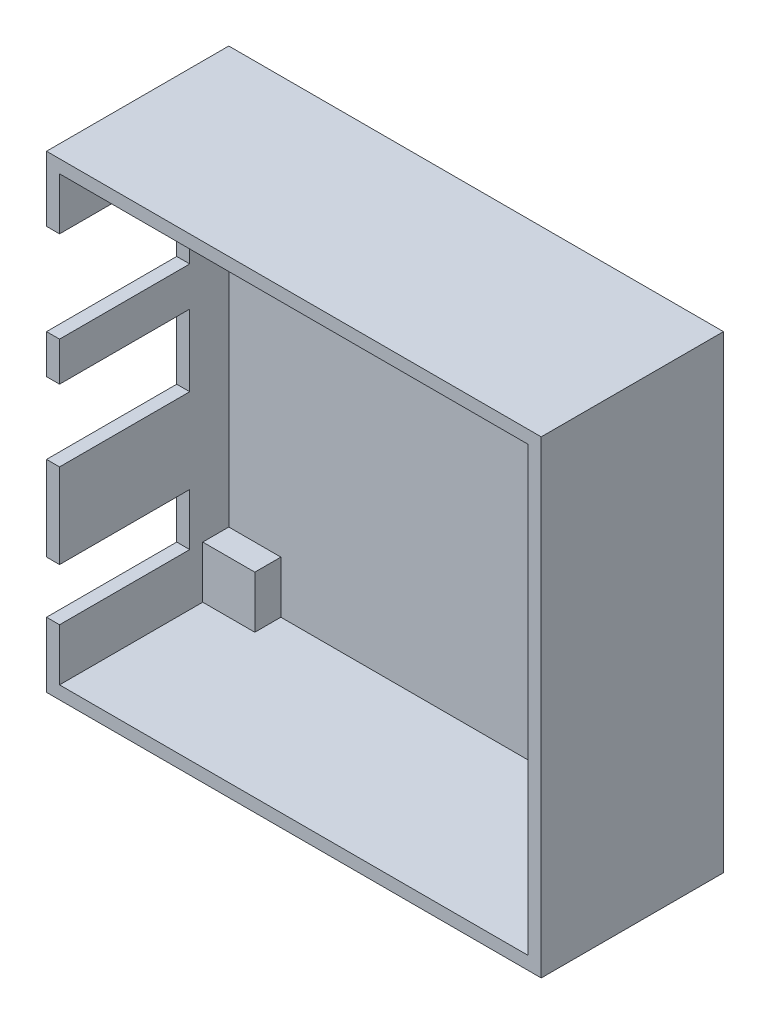
ISO-10303-21;
HEADER;
FILE_DESCRIPTION(('STEP AP214'),'2;1');
FILE_NAME('part.step','',(''),(''),'','','');
FILE_SCHEMA(('AUTOMOTIVE_DESIGN { 1 0 10303 214 1 1 1 1 }'));
ENDSEC;
DATA;
#1=APPLICATION_CONTEXT('core data for automotive mechanical design processes');
#2=APPLICATION_PROTOCOL_DEFINITION('international standard','automotive_design',2000,#1);
#3=PRODUCT_CONTEXT('',#1,'mechanical');
#4=PRODUCT('Part','Part','',(#3));
#5=PRODUCT_RELATED_PRODUCT_CATEGORY('part','',(#4));
#6=PRODUCT_DEFINITION_FORMATION('','',#4);
#7=PRODUCT_DEFINITION_CONTEXT('part definition',#1,'design');
#8=PRODUCT_DEFINITION('design','',#6,#7);
#9=PRODUCT_DEFINITION_SHAPE('','',#8);
#10=(LENGTH_UNIT() NAMED_UNIT(*) SI_UNIT(.MILLI.,.METRE.));
#11=(NAMED_UNIT(*) PLANE_ANGLE_UNIT() SI_UNIT($,.RADIAN.));
#12=(NAMED_UNIT(*) SI_UNIT($,.STERADIAN.) SOLID_ANGLE_UNIT());
#13=UNCERTAINTY_MEASURE_WITH_UNIT(LENGTH_MEASURE(1.E-05),#10,'distance_accuracy_value','');
#14=(GEOMETRIC_REPRESENTATION_CONTEXT(3) GLOBAL_UNCERTAINTY_ASSIGNED_CONTEXT((#13)) GLOBAL_UNIT_ASSIGNED_CONTEXT((#10,
#11,#12)) REPRESENTATION_CONTEXT('',''));
#15=CARTESIAN_POINT('',(0.,0.,0.));
#16=DIRECTION('',(0.,0.,1.));
#17=DIRECTION('',(1.,0.,0.));
#18=AXIS2_PLACEMENT_3D('',#15,#16,#17);
#19=CARTESIAN_POINT('',(-68.1385934908362,44.5557607090103,28.));
#20=DIRECTION('',(1.,0.,0.));
#21=DIRECTION('',(0.,1.,0.));
#22=AXIS2_PLACEMENT_3D('',#19,#20,#21);
#23=PLANE('',#22);
#24=DIRECTION('',(0.,-1.,0.));
#25=VECTOR('',#24,1.);
#26=CARTESIAN_POINT('',(-68.1385934908362,44.5557607090103,28.));
#27=LINE('',#26,#25);
#28=CARTESIAN_POINT('',(-68.1385934908362,44.5557607090103,28.));
#29=VERTEX_POINT('',#28);
#30=CARTESIAN_POINT('',(-68.1385934908362,36.5557607090103,28.));
#31=VERTEX_POINT('',#30);
#32=EDGE_CURVE('E396',#29,#31,#27,.T.);
#33=ORIENTED_EDGE('',*,*,#32,.T.);
#34=DIRECTION('',(0.,0.,-1.));
#35=VECTOR('',#34,1.);
#36=CARTESIAN_POINT('',(-68.1385934908362,36.5557607090103,28.));
#37=LINE('',#36,#35);
#38=CARTESIAN_POINT('',(-68.1385934908362,36.5557607090103,8.));
#39=VERTEX_POINT('',#38);
#40=EDGE_CURVE('E266',#31,#39,#37,.T.);
#41=ORIENTED_EDGE('',*,*,#40,.T.);
#42=DIRECTION('',(0.,1.,0.));
#43=VECTOR('',#42,1.);
#44=CARTESIAN_POINT('',(-68.1385934908362,44.5557607090103,8.));
#45=LINE('',#44,#43);
#46=CARTESIAN_POINT('',(-68.1385934908362,22.5557607090103,8.));
#47=VERTEX_POINT('',#46);
#48=EDGE_CURVE('E269',#47,#39,#45,.T.);
#49=ORIENTED_EDGE('',*,*,#48,.F.);
#50=DIRECTION('',(0.,0.,1.));
#51=VECTOR('',#50,1.);
#52=CARTESIAN_POINT('',(-68.1385934908362,22.5557607090103,28.));
#53=LINE('',#52,#51);
#54=CARTESIAN_POINT('',(-68.1385934908362,22.5557607090103,28.));
#55=VERTEX_POINT('',#54);
#56=EDGE_CURVE('E255',#47,#55,#53,.T.);
#57=ORIENTED_EDGE('',*,*,#56,.T.);
#58=CARTESIAN_POINT('',(-68.1385934908362,16.5557607090104,28.));
#59=VERTEX_POINT('',#58);
#60=EDGE_CURVE('E400',#55,#59,#27,.T.);
#61=ORIENTED_EDGE('',*,*,#60,.T.);
#62=DIRECTION('',(0.,0.,-1.));
#63=VECTOR('',#62,1.);
#64=CARTESIAN_POINT('',(-68.1385934908362,16.5557607090104,28.));
#65=LINE('',#64,#63);
#66=CARTESIAN_POINT('',(-68.1385934908362,16.5557607090104,8.));
#67=VERTEX_POINT('',#66);
#68=EDGE_CURVE('E283',#59,#67,#65,.T.);
#69=ORIENTED_EDGE('',*,*,#68,.T.);
#70=DIRECTION('',(0.,1.,0.));
#71=VECTOR('',#70,1.);
#72=CARTESIAN_POINT('',(-68.1385934908362,44.5557607090103,8.));
#73=LINE('',#72,#71);
#74=CARTESIAN_POINT('',(-68.1385934908362,5.55576070901035,8.));
#75=VERTEX_POINT('',#74);
#76=EDGE_CURVE('E286',#75,#67,#73,.T.);
#77=ORIENTED_EDGE('',*,*,#76,.F.);
#78=DIRECTION('',(0.,0.,1.));
#79=VECTOR('',#78,1.);
#80=CARTESIAN_POINT('',(-68.1385934908362,5.55576070901034,28.));
#81=LINE('',#80,#79);
#82=CARTESIAN_POINT('',(-68.1385934908362,5.55576070901035,28.));
#83=VERTEX_POINT('',#82);
#84=EDGE_CURVE('E278',#75,#83,#81,.T.);
#85=ORIENTED_EDGE('',*,*,#84,.T.);
#86=CARTESIAN_POINT('',(-68.1385934908362,-7.44423929098965,28.));
#87=VERTEX_POINT('',#86);
#88=EDGE_CURVE('E534',#83,#87,#27,.T.);
#89=ORIENTED_EDGE('',*,*,#88,.T.);
#90=DIRECTION('',(0.,0.,-1.));
#91=VECTOR('',#90,1.);
#92=CARTESIAN_POINT('',(-68.1385934908362,-7.44423929098965,28.));
#93=LINE('',#92,#91);
#94=CARTESIAN_POINT('',(-68.1385934908362,-7.44423929098965,8.));
#95=VERTEX_POINT('',#94);
#96=EDGE_CURVE('E296',#87,#95,#93,.T.);
#97=ORIENTED_EDGE('',*,*,#96,.T.);
#98=DIRECTION('',(0.,1.,0.));
#99=VECTOR('',#98,1.);
#100=CARTESIAN_POINT('',(-68.1385934908362,44.5557607090103,8.));
#101=LINE('',#100,#99);
#102=CARTESIAN_POINT('',(-68.1385934908362,-15.4442392909897,8.));
#103=VERTEX_POINT('',#102);
#104=EDGE_CURVE('E304',#103,#95,#101,.T.);
#105=ORIENTED_EDGE('',*,*,#104,.F.);
#106=DIRECTION('',(0.,0.,1.));
#107=VECTOR('',#106,1.);
#108=CARTESIAN_POINT('',(-68.1385934908362,-15.4442392909897,28.));
#109=LINE('',#108,#107);
#110=CARTESIAN_POINT('',(-68.1385934908362,-15.4442392909897,28.));
#111=VERTEX_POINT('',#110);
#112=EDGE_CURVE('E301',#103,#111,#109,.T.);
#113=ORIENTED_EDGE('',*,*,#112,.T.);
#114=CARTESIAN_POINT('',(-68.1385934908362,-23.4442392909897,28.));
#115=VERTEX_POINT('',#114);
#116=EDGE_CURVE('E401',#111,#115,#27,.T.);
#117=ORIENTED_EDGE('',*,*,#116,.T.);
#118=DIRECTION('',(0.,0.,-1.));
#119=VECTOR('',#118,1.);
#120=CARTESIAN_POINT('',(-68.1385934908362,-23.4442392909897,28.));
#121=LINE('',#120,#119);
#122=CARTESIAN_POINT('',(-68.1385934908362,-23.4442392909897,6.));
#123=VERTEX_POINT('',#122);
#124=EDGE_CURVE('E426',#115,#123,#121,.T.);
#125=ORIENTED_EDGE('',*,*,#124,.T.);
#126=DIRECTION('',(0.,-1.,0.));
#127=VECTOR('',#126,1.);
#128=CARTESIAN_POINT('',(-68.1385934908362,-23.4442392909897,6.));
#129=LINE('',#128,#127);
#130=CARTESIAN_POINT('',(-68.1385934908362,-15.4442392909897,6.));
#131=VERTEX_POINT('',#130);
#132=EDGE_CURVE('E307',#131,#123,#129,.T.);
#133=ORIENTED_EDGE('',*,*,#132,.F.);
#134=DIRECTION('',(0.,0.,-1.));
#135=VECTOR('',#134,1.);
#136=CARTESIAN_POINT('',(-68.1385934908362,-15.4442392909897,6.));
#137=LINE('',#136,#135);
#138=CARTESIAN_POINT('',(-68.1385934908362,-15.4442392909897,2.));
#139=VERTEX_POINT('',#138);
#140=EDGE_CURVE('E317',#131,#139,#137,.T.);
#141=ORIENTED_EDGE('',*,*,#140,.T.);
#142=DIRECTION('',(0.,-1.,0.));
#143=VECTOR('',#142,1.);
#144=CARTESIAN_POINT('',(-68.1385934908362,44.5557607090103,2.));
#145=LINE('',#144,#143);
#146=CARTESIAN_POINT('',(-68.1385934908362,36.5557607090103,2.));
#147=VERTEX_POINT('',#146);
#148=EDGE_CURVE('E395',#147,#139,#145,.T.);
#149=ORIENTED_EDGE('',*,*,#148,.F.);
#150=DIRECTION('',(0.,0.,-1.));
#151=VECTOR('',#150,1.);
#152=CARTESIAN_POINT('',(-68.1385934908362,36.5557607090103,6.));
#153=LINE('',#152,#151);
#154=CARTESIAN_POINT('',(-68.1385934908362,36.5557607090103,6.));
#155=VERTEX_POINT('',#154);
#156=EDGE_CURVE('E393',#155,#147,#153,.T.);
#157=ORIENTED_EDGE('',*,*,#156,.F.);
#158=DIRECTION('',(0.,-1.,0.));
#159=VECTOR('',#158,1.);
#160=CARTESIAN_POINT('',(-68.1385934908362,44.5557607090103,6.));
#161=LINE('',#160,#159);
#162=CARTESIAN_POINT('',(-68.1385934908362,44.5557607090103,6.));
#163=VERTEX_POINT('',#162);
#164=EDGE_CURVE('E374',#163,#155,#161,.T.);
#165=ORIENTED_EDGE('',*,*,#164,.F.);
#166=DIRECTION('',(0.,0.,-1.));
#167=VECTOR('',#166,1.);
#168=CARTESIAN_POINT('',(-68.1385934908362,44.5557607090103,28.));
#169=LINE('',#168,#167);
#170=EDGE_CURVE('E408',#29,#163,#169,.T.);
#171=ORIENTED_EDGE('',*,*,#170,.F.);
#172=EDGE_LOOP('',(#33,#41,#49,#57,#61,#69,#77,#85,#89,#97,#105,#113,#117,#125,#133,#141,#149,
#157,#165,#171));
#173=FACE_BOUND('',#172,.T.);
#174=ADVANCED_FACE('F35',(#173),#23,.T.);
#175=CARTESIAN_POINT('',(-70.1385934908362,46.5557607090103,2.));
#176=DIRECTION('',(1.,0.,0.));
#177=DIRECTION('',(0.,1.,0.));
#178=AXIS2_PLACEMENT_3D('',#175,#176,#177);
#179=PLANE('',#178);
#180=DIRECTION('',(0.,0.,-1.));
#181=VECTOR('',#180,1.);
#182=CARTESIAN_POINT('',(-70.1385934908362,36.5557607090103,2.));
#183=LINE('',#182,#181);
#184=CARTESIAN_POINT('',(-70.1385934908362,36.5557607090103,28.));
#185=VERTEX_POINT('',#184);
#186=CARTESIAN_POINT('',(-70.1385934908362,36.5557607090103,8.));
#187=VERTEX_POINT('',#186);
#188=EDGE_CURVE('E261',#185,#187,#183,.T.);
#189=ORIENTED_EDGE('',*,*,#188,.F.);
#190=DIRECTION('',(0.,-1.,0.));
#191=VECTOR('',#190,1.);
#192=CARTESIAN_POINT('',(-70.1385934908362,46.5557607090103,28.));
#193=LINE('',#192,#191);
#194=CARTESIAN_POINT('',(-70.1385934908362,46.5557607090103,28.));
#195=VERTEX_POINT('',#194);
#196=EDGE_CURVE('E430',#195,#185,#193,.T.);
#197=ORIENTED_EDGE('',*,*,#196,.F.);
#198=DIRECTION('',(0.,0.,-1.));
#199=VECTOR('',#198,1.);
#200=CARTESIAN_POINT('',(-70.1385934908362,46.5557607090103,2.));
#201=LINE('',#200,#199);
#202=CARTESIAN_POINT('',(-70.1385934908362,46.5557607090103,0.));
#203=VERTEX_POINT('',#202);
#204=EDGE_CURVE('E451',#195,#203,#201,.T.);
#205=ORIENTED_EDGE('',*,*,#204,.T.);
#206=DIRECTION('',(0.,-1.,0.));
#207=VECTOR('',#206,1.);
#208=CARTESIAN_POINT('',(-70.1385934908362,46.5557607090103,0.));
#209=LINE('',#208,#207);
#210=CARTESIAN_POINT('',(-70.1385934908361,-25.4442392909897,0.));
#211=VERTEX_POINT('',#210);
#212=EDGE_CURVE('E442',#203,#211,#209,.T.);
#213=ORIENTED_EDGE('',*,*,#212,.T.);
#214=DIRECTION('',(0.,0.,-1.));
#215=VECTOR('',#214,1.);
#216=CARTESIAN_POINT('',(-70.1385934908361,-25.4442392909897,2.));
#217=LINE('',#216,#215);
#218=CARTESIAN_POINT('',(-70.1385934908362,-25.4442392909897,28.));
#219=VERTEX_POINT('',#218);
#220=EDGE_CURVE('E460',#219,#211,#217,.T.);
#221=ORIENTED_EDGE('',*,*,#220,.F.);
#222=CARTESIAN_POINT('',(-70.1385934908362,-15.4442392909897,28.));
#223=VERTEX_POINT('',#222);
#224=EDGE_CURVE('E429',#223,#219,#193,.T.);
#225=ORIENTED_EDGE('',*,*,#224,.F.);
#226=DIRECTION('',(0.,0.,1.));
#227=VECTOR('',#226,1.);
#228=CARTESIAN_POINT('',(-70.1385934908361,-15.4442392909897,2.));
#229=LINE('',#228,#227);
#230=CARTESIAN_POINT('',(-70.1385934908361,-15.4442392909897,8.));
#231=VERTEX_POINT('',#230);
#232=EDGE_CURVE('E299',#231,#223,#229,.T.);
#233=ORIENTED_EDGE('',*,*,#232,.F.);
#234=DIRECTION('',(0.,1.,0.));
#235=VECTOR('',#234,1.);
#236=CARTESIAN_POINT('',(-70.1385934908362,46.5557607090103,8.));
#237=LINE('',#236,#235);
#238=CARTESIAN_POINT('',(-70.1385934908361,-7.44423929098965,8.));
#239=VERTEX_POINT('',#238);
#240=EDGE_CURVE('E469',#231,#239,#237,.T.);
#241=ORIENTED_EDGE('',*,*,#240,.T.);
#242=DIRECTION('',(0.,0.,-1.));
#243=VECTOR('',#242,1.);
#244=CARTESIAN_POINT('',(-70.1385934908362,-7.44423929098965,2.));
#245=LINE('',#244,#243);
#246=CARTESIAN_POINT('',(-70.1385934908362,-7.44423929098965,28.));
#247=VERTEX_POINT('',#246);
#248=EDGE_CURVE('E294',#247,#239,#245,.T.);
#249=ORIENTED_EDGE('',*,*,#248,.F.);
#250=CARTESIAN_POINT('',(-70.1385934908362,5.55576070901034,28.));
#251=VERTEX_POINT('',#250);
#252=EDGE_CURVE('E546',#251,#247,#193,.T.);
#253=ORIENTED_EDGE('',*,*,#252,.F.);
#254=DIRECTION('',(0.,0.,1.));
#255=VECTOR('',#254,1.);
#256=CARTESIAN_POINT('',(-70.1385934908362,5.55576070901034,2.));
#257=LINE('',#256,#255);
#258=CARTESIAN_POINT('',(-70.1385934908362,5.55576070901035,8.));
#259=VERTEX_POINT('',#258);
#260=EDGE_CURVE('E58',#259,#251,#257,.T.);
#261=ORIENTED_EDGE('',*,*,#260,.F.);
#262=DIRECTION('',(0.,1.,0.));
#263=VECTOR('',#262,1.);
#264=CARTESIAN_POINT('',(-70.1385934908362,46.5557607090103,8.));
#265=LINE('',#264,#263);
#266=CARTESIAN_POINT('',(-70.1385934908362,16.5557607090103,8.));
#267=VERTEX_POINT('',#266);
#268=EDGE_CURVE('E477',#259,#267,#265,.T.);
#269=ORIENTED_EDGE('',*,*,#268,.T.);
#270=DIRECTION('',(0.,0.,-1.));
#271=VECTOR('',#270,1.);
#272=CARTESIAN_POINT('',(-70.1385934908362,16.5557607090103,2.));
#273=LINE('',#272,#271);
#274=CARTESIAN_POINT('',(-70.1385934908362,16.5557607090103,28.));
#275=VERTEX_POINT('',#274);
#276=EDGE_CURVE('E281',#275,#267,#273,.T.);
#277=ORIENTED_EDGE('',*,*,#276,.F.);
#278=CARTESIAN_POINT('',(-70.1385934908362,22.5557607090103,28.));
#279=VERTEX_POINT('',#278);
#280=EDGE_CURVE('E259',#279,#275,#193,.T.);
#281=ORIENTED_EDGE('',*,*,#280,.F.);
#282=DIRECTION('',(0.,0.,1.));
#283=VECTOR('',#282,1.);
#284=CARTESIAN_POINT('',(-70.1385934908362,22.5557607090103,2.));
#285=LINE('',#284,#283);
#286=CARTESIAN_POINT('',(-70.1385934908362,22.5557607090103,8.));
#287=VERTEX_POINT('',#286);
#288=EDGE_CURVE('E50',#287,#279,#285,.T.);
#289=ORIENTED_EDGE('',*,*,#288,.F.);
#290=DIRECTION('',(0.,1.,0.));
#291=VECTOR('',#290,1.);
#292=CARTESIAN_POINT('',(-70.1385934908362,46.5557607090103,8.));
#293=LINE('',#292,#291);
#294=EDGE_CURVE('E11',#287,#187,#293,.T.);
#295=ORIENTED_EDGE('',*,*,#294,.T.);
#296=EDGE_LOOP('',(#189,#197,#205,#213,#221,#225,#233,#241,#249,#253,#261,#269,#277,#281,#289,#295));
#297=FACE_BOUND('',#296,.T.);
#298=ADVANCED_FACE('F37',(#297),#179,.F.);
#299=CARTESIAN_POINT('',(0.,0.,28.));
#300=DIRECTION('',(0.,0.,1.));
#301=DIRECTION('',(1.,0.,0.));
#302=AXIS2_PLACEMENT_3D('',#299,#300,#301);
#303=PLANE('',#302);
#304=ORIENTED_EDGE('',*,*,#196,.T.);
#305=DIRECTION('',(1.,0.,0.));
#306=VECTOR('',#305,1.);
#307=CARTESIAN_POINT('',(0.,36.5557607090103,28.));
#308=LINE('',#307,#306);
#309=EDGE_CURVE('E43',#185,#31,#308,.T.);
#310=ORIENTED_EDGE('',*,*,#309,.T.);
#311=ORIENTED_EDGE('',*,*,#32,.F.);
#312=DIRECTION('',(-1.,0.,0.));
#313=VECTOR('',#312,1.);
#314=CARTESIAN_POINT('',(-68.1385934908362,44.5557607090103,28.));
#315=LINE('',#314,#313);
#316=CARTESIAN_POINT('',(3.86140650916383,44.5557607090103,28.));
#317=VERTEX_POINT('',#316);
#318=EDGE_CURVE('E406',#317,#29,#315,.T.);
#319=ORIENTED_EDGE('',*,*,#318,.F.);
#320=DIRECTION('',(0.,1.,0.));
#321=VECTOR('',#320,1.);
#322=CARTESIAN_POINT('',(3.86140650916383,44.5557607090103,28.));
#323=LINE('',#322,#321);
#324=CARTESIAN_POINT('',(3.86140650916384,-23.4442392909897,28.));
#325=VERTEX_POINT('',#324);
#326=EDGE_CURVE('E403',#325,#317,#323,.T.);
#327=ORIENTED_EDGE('',*,*,#326,.F.);
#328=DIRECTION('',(1.,0.,0.));
#329=VECTOR('',#328,1.);
#330=CARTESIAN_POINT('',(-68.1385934908362,-23.4442392909897,28.));
#331=LINE('',#330,#329);
#332=EDGE_CURVE('E399',#115,#325,#331,.T.);
#333=ORIENTED_EDGE('',*,*,#332,.F.);
#334=ORIENTED_EDGE('',*,*,#116,.F.);
#335=DIRECTION('',(-1.,0.,0.));
#336=VECTOR('',#335,1.);
#337=CARTESIAN_POINT('',(0.,-15.4442392909897,28.));
#338=LINE('',#337,#336);
#339=EDGE_CURVE('E466',#111,#223,#338,.T.);
#340=ORIENTED_EDGE('',*,*,#339,.T.);
#341=ORIENTED_EDGE('',*,*,#224,.T.);
#342=DIRECTION('',(1.,0.,0.));
#343=VECTOR('',#342,1.);
#344=CARTESIAN_POINT('',(-70.1385934908362,-25.4442392909897,28.));
#345=LINE('',#344,#343);
#346=CARTESIAN_POINT('',(5.86140650916384,-25.4442392909897,28.));
#347=VERTEX_POINT('',#346);
#348=EDGE_CURVE('E433',#219,#347,#345,.T.);
#349=ORIENTED_EDGE('',*,*,#348,.T.);
#350=DIRECTION('',(0.,1.,0.));
#351=VECTOR('',#350,1.);
#352=CARTESIAN_POINT('',(5.86140650916383,46.5557607090103,28.));
#353=LINE('',#352,#351);
#354=CARTESIAN_POINT('',(5.86140650916383,46.5557607090103,28.));
#355=VERTEX_POINT('',#354);
#356=EDGE_CURVE('E436',#347,#355,#353,.T.);
#357=ORIENTED_EDGE('',*,*,#356,.T.);
#358=DIRECTION('',(-1.,0.,0.));
#359=VECTOR('',#358,1.);
#360=CARTESIAN_POINT('',(-70.1385934908362,46.5557607090103,28.));
#361=LINE('',#360,#359);
#362=EDGE_CURVE('E439',#355,#195,#361,.T.);
#363=ORIENTED_EDGE('',*,*,#362,.T.);
#364=EDGE_LOOP('',(#304,#310,#311,#319,#327,#333,#334,#340,#341,#349,#357,#363));
#365=FACE_BOUND('',#364,.T.);
#366=ADVANCED_FACE('F484',(#365),#303,.T.);
#367=ORIENTED_EDGE('',*,*,#60,.F.);
#368=DIRECTION('',(-1.,0.,0.));
#369=VECTOR('',#368,1.);
#370=CARTESIAN_POINT('',(0.,22.5557607090103,28.));
#371=LINE('',#370,#369);
#372=EDGE_CURVE('E480',#55,#279,#371,.T.);
#373=ORIENTED_EDGE('',*,*,#372,.T.);
#374=ORIENTED_EDGE('',*,*,#280,.T.);
#375=DIRECTION('',(1.,0.,0.));
#376=VECTOR('',#375,1.);
#377=CARTESIAN_POINT('',(0.,16.5557607090104,28.));
#378=LINE('',#377,#376);
#379=EDGE_CURVE('E474',#275,#59,#378,.T.);
#380=ORIENTED_EDGE('',*,*,#379,.T.);
#381=EDGE_LOOP('',(#367,#373,#374,#380));
#382=FACE_BOUND('',#381,.T.);
#383=ADVANCED_FACE('F545',(#382),#303,.T.);
#384=ORIENTED_EDGE('',*,*,#88,.F.);
#385=DIRECTION('',(-1.,0.,0.));
#386=VECTOR('',#385,1.);
#387=CARTESIAN_POINT('',(0.,5.55576070901036,28.));
#388=LINE('',#387,#386);
#389=EDGE_CURVE('E472',#83,#251,#388,.T.);
#390=ORIENTED_EDGE('',*,*,#389,.T.);
#391=ORIENTED_EDGE('',*,*,#252,.T.);
#392=DIRECTION('',(1.,0.,0.));
#393=VECTOR('',#392,1.);
#394=CARTESIAN_POINT('',(0.,-7.44423929098965,28.));
#395=LINE('',#394,#393);
#396=EDGE_CURVE('E463',#247,#87,#395,.T.);
#397=ORIENTED_EDGE('',*,*,#396,.T.);
#398=EDGE_LOOP('',(#384,#390,#391,#397));
#399=FACE_BOUND('',#398,.T.);
#400=ADVANCED_FACE('F588',(#399),#303,.T.);
#401=CARTESIAN_POINT('',(0.,0.,2.));
#402=DIRECTION('',(0.,0.,1.));
#403=DIRECTION('',(1.,0.,0.));
#404=AXIS2_PLACEMENT_3D('',#401,#402,#403);
#405=PLANE('',#404);
#406=DIRECTION('',(-1.,0.,0.));
#407=VECTOR('',#406,1.);
#408=CARTESIAN_POINT('',(-68.1385934908362,-15.4442392909897,2.));
#409=LINE('',#408,#407);
#410=CARTESIAN_POINT('',(-60.1385934908362,-15.4442392909897,2.));
#411=VERTEX_POINT('',#410);
#412=EDGE_CURVE('E310',#411,#139,#409,.T.);
#413=ORIENTED_EDGE('',*,*,#412,.F.);
#414=DIRECTION('',(0.,1.,0.));
#415=VECTOR('',#414,1.);
#416=CARTESIAN_POINT('',(-60.1385934908362,-23.4442392909897,2.));
#417=LINE('',#416,#415);
#418=CARTESIAN_POINT('',(-60.1385934908362,-23.4442392909897,2.));
#419=VERTEX_POINT('',#418);
#420=EDGE_CURVE('E306',#419,#411,#417,.T.);
#421=ORIENTED_EDGE('',*,*,#420,.F.);
#422=DIRECTION('',(1.,0.,0.));
#423=VECTOR('',#422,1.);
#424=CARTESIAN_POINT('',(-68.1385934908362,-23.4442392909897,2.));
#425=LINE('',#424,#423);
#426=CARTESIAN_POINT('',(-4.13859349083616,-23.4442392909897,2.));
#427=VERTEX_POINT('',#426);
#428=EDGE_CURVE('E411',#419,#427,#425,.T.);
#429=ORIENTED_EDGE('',*,*,#428,.T.);
#430=DIRECTION('',(0.,-1.,0.));
#431=VECTOR('',#430,1.);
#432=CARTESIAN_POINT('',(-4.13859349083616,-23.4442392909897,2.));
#433=LINE('',#432,#431);
#434=CARTESIAN_POINT('',(-4.13859349083616,-15.4442392909897,2.));
#435=VERTEX_POINT('',#434);
#436=EDGE_CURVE('E352',#435,#427,#433,.T.);
#437=ORIENTED_EDGE('',*,*,#436,.F.);
#438=DIRECTION('',(-1.,0.,0.));
#439=VECTOR('',#438,1.);
#440=CARTESIAN_POINT('',(3.86140650916383,-15.4442392909897,2.));
#441=LINE('',#440,#439);
#442=CARTESIAN_POINT('',(3.86140650916383,-15.4442392909897,2.));
#443=VERTEX_POINT('',#442);
#444=EDGE_CURVE('E347',#443,#435,#441,.T.);
#445=ORIENTED_EDGE('',*,*,#444,.F.);
#446=DIRECTION('',(0.,1.,0.));
#447=VECTOR('',#446,1.);
#448=CARTESIAN_POINT('',(3.86140650916383,44.5557607090103,2.));
#449=LINE('',#448,#447);
#450=CARTESIAN_POINT('',(3.86140650916384,36.5557607090103,2.));
#451=VERTEX_POINT('',#450);
#452=EDGE_CURVE('E413',#443,#451,#449,.T.);
#453=ORIENTED_EDGE('',*,*,#452,.T.);
#454=DIRECTION('',(1.,0.,0.));
#455=VECTOR('',#454,1.);
#456=CARTESIAN_POINT('',(3.86140650916384,36.5557607090103,2.));
#457=LINE('',#456,#455);
#458=CARTESIAN_POINT('',(-4.13859349083616,36.5557607090103,2.));
#459=VERTEX_POINT('',#458);
#460=EDGE_CURVE('E331',#459,#451,#457,.T.);
#461=ORIENTED_EDGE('',*,*,#460,.F.);
#462=DIRECTION('',(0.,-1.,0.));
#463=VECTOR('',#462,1.);
#464=CARTESIAN_POINT('',(-4.13859349083616,44.5557607090103,2.));
#465=LINE('',#464,#463);
#466=CARTESIAN_POINT('',(-4.13859349083616,44.5557607090103,2.));
#467=VERTEX_POINT('',#466);
#468=EDGE_CURVE('E327',#467,#459,#465,.T.);
#469=ORIENTED_EDGE('',*,*,#468,.F.);
#470=DIRECTION('',(-1.,0.,0.));
#471=VECTOR('',#470,1.);
#472=CARTESIAN_POINT('',(-68.1385934908362,44.5557607090103,2.));
#473=LINE('',#472,#471);
#474=CARTESIAN_POINT('',(-60.1385934908362,44.5557607090103,2.));
#475=VERTEX_POINT('',#474);
#476=EDGE_CURVE('E416',#467,#475,#473,.T.);
#477=ORIENTED_EDGE('',*,*,#476,.T.);
#478=DIRECTION('',(0.,1.,0.));
#479=VECTOR('',#478,1.);
#480=CARTESIAN_POINT('',(-60.1385934908362,44.5557607090103,2.));
#481=LINE('',#480,#479);
#482=CARTESIAN_POINT('',(-60.1385934908362,36.5557607090103,2.));
#483=VERTEX_POINT('',#482);
#484=EDGE_CURVE('E378',#483,#475,#481,.T.);
#485=ORIENTED_EDGE('',*,*,#484,.F.);
#486=DIRECTION('',(1.,0.,0.));
#487=VECTOR('',#486,1.);
#488=CARTESIAN_POINT('',(-68.1385934908362,36.5557607090103,2.));
#489=LINE('',#488,#487);
#490=EDGE_CURVE('E373',#147,#483,#489,.T.);
#491=ORIENTED_EDGE('',*,*,#490,.F.);
#492=ORIENTED_EDGE('',*,*,#148,.T.);
#493=EDGE_LOOP('',(#413,#421,#429,#437,#445,#453,#461,#469,#477,#485,#491,#492));
#494=FACE_BOUND('',#493,.T.);
#495=ADVANCED_FACE('F521',(#494),#405,.T.);
#496=CARTESIAN_POINT('',(-68.1385934908362,-23.4442392909897,28.));
#497=DIRECTION('',(0.,1.,0.));
#498=DIRECTION('',(0.,0.,1.));
#499=AXIS2_PLACEMENT_3D('',#496,#497,#498);
#500=PLANE('',#499);
#501=ORIENTED_EDGE('',*,*,#428,.F.);
#502=DIRECTION('',(0.,0.,-1.));
#503=VECTOR('',#502,1.);
#504=CARTESIAN_POINT('',(-60.1385934908362,-23.4442392909897,6.));
#505=LINE('',#504,#503);
#506=CARTESIAN_POINT('',(-60.1385934908362,-23.4442392909897,6.));
#507=VERTEX_POINT('',#506);
#508=EDGE_CURVE('E325',#507,#419,#505,.T.);
#509=ORIENTED_EDGE('',*,*,#508,.F.);
#510=DIRECTION('',(1.,0.,0.));
#511=VECTOR('',#510,1.);
#512=CARTESIAN_POINT('',(-68.1385934908362,-23.4442392909897,6.));
#513=LINE('',#512,#511);
#514=EDGE_CURVE('E309',#123,#507,#513,.T.);
#515=ORIENTED_EDGE('',*,*,#514,.F.);
#516=ORIENTED_EDGE('',*,*,#124,.F.);
#517=ORIENTED_EDGE('',*,*,#332,.T.);
#518=DIRECTION('',(0.,0.,-1.));
#519=VECTOR('',#518,1.);
#520=CARTESIAN_POINT('',(3.86140650916384,-23.4442392909897,28.));
#521=LINE('',#520,#519);
#522=CARTESIAN_POINT('',(3.86140650916384,-23.4442392909897,6.00000000000001));
#523=VERTEX_POINT('',#522);
#524=EDGE_CURVE('E423',#325,#523,#521,.T.);
#525=ORIENTED_EDGE('',*,*,#524,.T.);
#526=DIRECTION('',(1.,0.,0.));
#527=VECTOR('',#526,1.);
#528=CARTESIAN_POINT('',(3.86140650916384,-23.4442392909897,6.));
#529=LINE('',#528,#527);
#530=CARTESIAN_POINT('',(-4.13859349083616,-23.4442392909897,6.));
#531=VERTEX_POINT('',#530);
#532=EDGE_CURVE('E357',#531,#523,#529,.T.);
#533=ORIENTED_EDGE('',*,*,#532,.F.);
#534=DIRECTION('',(0.,0.,-1.));
#535=VECTOR('',#534,1.);
#536=CARTESIAN_POINT('',(-4.13859349083616,-23.4442392909897,6.));
#537=LINE('',#536,#535);
#538=EDGE_CURVE('E360',#531,#427,#537,.T.);
#539=ORIENTED_EDGE('',*,*,#538,.T.);
#540=EDGE_LOOP('',(#501,#509,#515,#516,#517,#525,#533,#539));
#541=FACE_BOUND('',#540,.T.);
#542=ADVANCED_FACE('F506',(#541),#500,.T.);
#543=CARTESIAN_POINT('',(3.86140650916383,44.5557607090103,28.));
#544=DIRECTION('',(-1.,0.,0.));
#545=DIRECTION('',(0.,-1.,0.));
#546=AXIS2_PLACEMENT_3D('',#543,#544,#545);
#547=PLANE('',#546);
#548=DIRECTION('',(0.,1.,0.));
#549=VECTOR('',#548,1.);
#550=CARTESIAN_POINT('',(3.86140650916383,44.5557607090103,6.));
#551=LINE('',#550,#549);
#552=CARTESIAN_POINT('',(3.86140650916384,36.5557607090103,6.));
#553=VERTEX_POINT('',#552);
#554=CARTESIAN_POINT('',(3.86140650916383,44.5557607090103,6.00000000000001));
#555=VERTEX_POINT('',#554);
#556=EDGE_CURVE('E328',#553,#555,#551,.T.);
#557=ORIENTED_EDGE('',*,*,#556,.F.);
#558=DIRECTION('',(0.,0.,-1.));
#559=VECTOR('',#558,1.);
#560=CARTESIAN_POINT('',(3.86140650916384,36.5557607090103,6.));
#561=LINE('',#560,#559);
#562=EDGE_CURVE('E337',#553,#451,#561,.T.);
#563=ORIENTED_EDGE('',*,*,#562,.T.);
#564=ORIENTED_EDGE('',*,*,#452,.F.);
#565=DIRECTION('',(0.,0.,-1.));
#566=VECTOR('',#565,1.);
#567=CARTESIAN_POINT('',(3.86140650916383,-15.4442392909897,6.));
#568=LINE('',#567,#566);
#569=CARTESIAN_POINT('',(3.86140650916383,-15.4442392909897,6.));
#570=VERTEX_POINT('',#569);
#571=EDGE_CURVE('E370',#570,#443,#568,.T.);
#572=ORIENTED_EDGE('',*,*,#571,.F.);
#573=DIRECTION('',(0.,1.,0.));
#574=VECTOR('',#573,1.);
#575=CARTESIAN_POINT('',(3.86140650916384,-23.4442392909897,6.));
#576=LINE('',#575,#574);
#577=EDGE_CURVE('E348',#523,#570,#576,.T.);
#578=ORIENTED_EDGE('',*,*,#577,.F.);
#579=ORIENTED_EDGE('',*,*,#524,.F.);
#580=ORIENTED_EDGE('',*,*,#326,.T.);
#581=DIRECTION('',(0.,0.,-1.));
#582=VECTOR('',#581,1.);
#583=CARTESIAN_POINT('',(3.86140650916383,44.5557607090103,28.));
#584=LINE('',#583,#582);
#585=EDGE_CURVE('E420',#317,#555,#584,.T.);
#586=ORIENTED_EDGE('',*,*,#585,.T.);
#587=EDGE_LOOP('',(#557,#563,#564,#572,#578,#579,#580,#586));
#588=FACE_BOUND('',#587,.T.);
#589=ADVANCED_FACE('F503',(#588),#547,.T.);
#590=CARTESIAN_POINT('',(-68.1385934908362,44.5557607090103,28.));
#591=DIRECTION('',(0.,-1.,0.));
#592=DIRECTION('',(0.,0.,-1.));
#593=AXIS2_PLACEMENT_3D('',#590,#591,#592);
#594=PLANE('',#593);
#595=ORIENTED_EDGE('',*,*,#476,.F.);
#596=DIRECTION('',(0.,0.,-1.));
#597=VECTOR('',#596,1.);
#598=CARTESIAN_POINT('',(-4.13859349083616,44.5557607090103,6.));
#599=LINE('',#598,#597);
#600=CARTESIAN_POINT('',(-4.13859349083616,44.5557607090103,6.));
#601=VERTEX_POINT('',#600);
#602=EDGE_CURVE('E345',#601,#467,#599,.T.);
#603=ORIENTED_EDGE('',*,*,#602,.F.);
#604=DIRECTION('',(-1.,0.,0.));
#605=VECTOR('',#604,1.);
#606=CARTESIAN_POINT('',(3.86140650916383,44.5557607090103,6.));
#607=LINE('',#606,#605);
#608=EDGE_CURVE('E330',#555,#601,#607,.T.);
#609=ORIENTED_EDGE('',*,*,#608,.F.);
#610=ORIENTED_EDGE('',*,*,#585,.F.);
#611=ORIENTED_EDGE('',*,*,#318,.T.);
#612=ORIENTED_EDGE('',*,*,#170,.T.);
#613=DIRECTION('',(-1.,0.,0.));
#614=VECTOR('',#613,1.);
#615=CARTESIAN_POINT('',(-68.1385934908362,44.5557607090103,6.));
#616=LINE('',#615,#614);
#617=CARTESIAN_POINT('',(-60.1385934908362,44.5557607090103,6.));
#618=VERTEX_POINT('',#617);
#619=EDGE_CURVE('E382',#618,#163,#616,.T.);
#620=ORIENTED_EDGE('',*,*,#619,.F.);
#621=DIRECTION('',(0.,0.,-1.));
#622=VECTOR('',#621,1.);
#623=CARTESIAN_POINT('',(-60.1385934908362,44.5557607090103,6.));
#624=LINE('',#623,#622);
#625=EDGE_CURVE('E384',#618,#475,#624,.T.);
#626=ORIENTED_EDGE('',*,*,#625,.T.);
#627=EDGE_LOOP('',(#595,#603,#609,#610,#611,#612,#620,#626));
#628=FACE_BOUND('',#627,.T.);
#629=ADVANCED_FACE('F495',(#628),#594,.T.);
#630=CARTESIAN_POINT('',(-70.1385934908361,-25.4442392909897,2.));
#631=DIRECTION('',(0.,1.,0.));
#632=DIRECTION('',(0.,0.,1.));
#633=AXIS2_PLACEMENT_3D('',#630,#631,#632);
#634=PLANE('',#633);
#635=DIRECTION('',(1.,0.,0.));
#636=VECTOR('',#635,1.);
#637=CARTESIAN_POINT('',(-70.1385934908361,-25.4442392909897,0.));
#638=LINE('',#637,#636);
#639=CARTESIAN_POINT('',(5.86140650916384,-25.4442392909897,0.));
#640=VERTEX_POINT('',#639);
#641=EDGE_CURVE('E445',#211,#640,#638,.T.);
#642=ORIENTED_EDGE('',*,*,#641,.T.);
#643=DIRECTION('',(0.,0.,-1.));
#644=VECTOR('',#643,1.);
#645=CARTESIAN_POINT('',(5.86140650916384,-25.4442392909897,2.));
#646=LINE('',#645,#644);
#647=EDGE_CURVE('E457',#347,#640,#646,.T.);
#648=ORIENTED_EDGE('',*,*,#647,.F.);
#649=ORIENTED_EDGE('',*,*,#348,.F.);
#650=ORIENTED_EDGE('',*,*,#220,.T.);
#651=EDGE_LOOP('',(#642,#648,#649,#650));
#652=FACE_BOUND('',#651,.T.);
#653=ADVANCED_FACE('F557',(#652),#634,.F.);
#654=CARTESIAN_POINT('',(5.86140650916382,46.5557607090103,2.));
#655=DIRECTION('',(-1.,0.,0.));
#656=DIRECTION('',(0.,-1.,0.));
#657=AXIS2_PLACEMENT_3D('',#654,#655,#656);
#658=PLANE('',#657);
#659=DIRECTION('',(0.,1.,0.));
#660=VECTOR('',#659,1.);
#661=CARTESIAN_POINT('',(5.86140650916382,46.5557607090103,0.));
#662=LINE('',#661,#660);
#663=CARTESIAN_POINT('',(5.86140650916382,46.5557607090103,0.));
#664=VERTEX_POINT('',#663);
#665=EDGE_CURVE('E447',#640,#664,#662,.T.);
#666=ORIENTED_EDGE('',*,*,#665,.T.);
#667=DIRECTION('',(0.,0.,-1.));
#668=VECTOR('',#667,1.);
#669=CARTESIAN_POINT('',(5.86140650916382,46.5557607090103,2.));
#670=LINE('',#669,#668);
#671=EDGE_CURVE('E454',#355,#664,#670,.T.);
#672=ORIENTED_EDGE('',*,*,#671,.F.);
#673=ORIENTED_EDGE('',*,*,#356,.F.);
#674=ORIENTED_EDGE('',*,*,#647,.T.);
#675=EDGE_LOOP('',(#666,#672,#673,#674));
#676=FACE_BOUND('',#675,.T.);
#677=ADVANCED_FACE('F560',(#676),#658,.F.);
#678=CARTESIAN_POINT('',(-70.1385934908362,46.5557607090103,2.));
#679=DIRECTION('',(0.,-1.,0.));
#680=DIRECTION('',(0.,0.,-1.));
#681=AXIS2_PLACEMENT_3D('',#678,#679,#680);
#682=PLANE('',#681);
#683=DIRECTION('',(-1.,0.,0.));
#684=VECTOR('',#683,1.);
#685=CARTESIAN_POINT('',(-70.1385934908362,46.5557607090103,0.));
#686=LINE('',#685,#684);
#687=EDGE_CURVE('E449',#664,#203,#686,.T.);
#688=ORIENTED_EDGE('',*,*,#687,.T.);
#689=ORIENTED_EDGE('',*,*,#204,.F.);
#690=ORIENTED_EDGE('',*,*,#362,.F.);
#691=ORIENTED_EDGE('',*,*,#671,.T.);
#692=EDGE_LOOP('',(#688,#689,#690,#691));
#693=FACE_BOUND('',#692,.T.);
#694=ADVANCED_FACE('F565',(#693),#682,.F.);
#695=CARTESIAN_POINT('',(0.,0.,0.));
#696=DIRECTION('',(0.,0.,1.));
#697=DIRECTION('',(1.,0.,0.));
#698=AXIS2_PLACEMENT_3D('',#695,#696,#697);
#699=PLANE('',#698);
#700=ORIENTED_EDGE('',*,*,#212,.F.);
#701=ORIENTED_EDGE('',*,*,#687,.F.);
#702=ORIENTED_EDGE('',*,*,#665,.F.);
#703=ORIENTED_EDGE('',*,*,#641,.F.);
#704=EDGE_LOOP('',(#700,#701,#702,#703));
#705=FACE_BOUND('',#704,.T.);
#706=ADVANCED_FACE('F563',(#705),#699,.F.);
#707=CARTESIAN_POINT('',(-68.1385934908362,36.5557607090103,6.));
#708=DIRECTION('',(0.,1.,0.));
#709=DIRECTION('',(-1.,0.,0.));
#710=AXIS2_PLACEMENT_3D('',#707,#708,#709);
#711=PLANE('',#710);
#712=ORIENTED_EDGE('',*,*,#490,.T.);
#713=DIRECTION('',(0.,0.,-1.));
#714=VECTOR('',#713,1.);
#715=CARTESIAN_POINT('',(-60.1385934908362,36.5557607090103,6.));
#716=LINE('',#715,#714);
#717=CARTESIAN_POINT('',(-60.1385934908362,36.5557607090103,6.));
#718=VERTEX_POINT('',#717);
#719=EDGE_CURVE('E391',#718,#483,#716,.T.);
#720=ORIENTED_EDGE('',*,*,#719,.F.);
#721=DIRECTION('',(1.,0.,0.));
#722=VECTOR('',#721,1.);
#723=CARTESIAN_POINT('',(-68.1385934908362,36.5557607090103,6.));
#724=LINE('',#723,#722);
#725=EDGE_CURVE('E377',#155,#718,#724,.T.);
#726=ORIENTED_EDGE('',*,*,#725,.F.);
#727=ORIENTED_EDGE('',*,*,#156,.T.);
#728=EDGE_LOOP('',(#712,#720,#726,#727));
#729=FACE_BOUND('',#728,.T.);
#730=ADVANCED_FACE('F593',(#729),#711,.F.);
#731=CARTESIAN_POINT('',(-60.1385934908362,44.5557607090103,6.));
#732=DIRECTION('',(-1.,0.,0.));
#733=DIRECTION('',(0.,0.,1.));
#734=AXIS2_PLACEMENT_3D('',#731,#732,#733);
#735=PLANE('',#734);
#736=ORIENTED_EDGE('',*,*,#484,.T.);
#737=ORIENTED_EDGE('',*,*,#625,.F.);
#738=DIRECTION('',(0.,1.,0.));
#739=VECTOR('',#738,1.);
#740=CARTESIAN_POINT('',(-60.1385934908362,44.5557607090103,6.));
#741=LINE('',#740,#739);
#742=EDGE_CURVE('E380',#718,#618,#741,.T.);
#743=ORIENTED_EDGE('',*,*,#742,.F.);
#744=ORIENTED_EDGE('',*,*,#719,.T.);
#745=EDGE_LOOP('',(#736,#737,#743,#744));
#746=FACE_BOUND('',#745,.T.);
#747=ADVANCED_FACE('F608',(#746),#735,.F.);
#748=CARTESIAN_POINT('',(0.,0.,6.));
#749=DIRECTION('',(0.,0.,1.));
#750=DIRECTION('',(1.,0.,0.));
#751=AXIS2_PLACEMENT_3D('',#748,#749,#750);
#752=PLANE('',#751);
#753=ORIENTED_EDGE('',*,*,#164,.T.);
#754=ORIENTED_EDGE('',*,*,#725,.T.);
#755=ORIENTED_EDGE('',*,*,#742,.T.);
#756=ORIENTED_EDGE('',*,*,#619,.T.);
#757=EDGE_LOOP('',(#753,#754,#755,#756));
#758=FACE_BOUND('',#757,.T.);
#759=ADVANCED_FACE('F612',(#758),#752,.T.);
#760=CARTESIAN_POINT('',(3.86140650916383,-15.4442392909897,6.));
#761=DIRECTION('',(0.,-1.,0.));
#762=DIRECTION('',(0.,0.,-1.));
#763=AXIS2_PLACEMENT_3D('',#760,#761,#762);
#764=PLANE('',#763);
#765=ORIENTED_EDGE('',*,*,#444,.T.);
#766=DIRECTION('',(0.,0.,-1.));
#767=VECTOR('',#766,1.);
#768=CARTESIAN_POINT('',(-4.13859349083616,-15.4442392909897,6.));
#769=LINE('',#768,#767);
#770=CARTESIAN_POINT('',(-4.13859349083616,-15.4442392909897,6.));
#771=VERTEX_POINT('',#770);
#772=EDGE_CURVE('E367',#771,#435,#769,.T.);
#773=ORIENTED_EDGE('',*,*,#772,.F.);
#774=DIRECTION('',(-1.,0.,0.));
#775=VECTOR('',#774,1.);
#776=CARTESIAN_POINT('',(3.86140650916383,-15.4442392909897,6.));
#777=LINE('',#776,#775);
#778=EDGE_CURVE('E351',#570,#771,#777,.T.);
#779=ORIENTED_EDGE('',*,*,#778,.F.);
#780=ORIENTED_EDGE('',*,*,#571,.T.);
#781=EDGE_LOOP('',(#765,#773,#779,#780));
#782=FACE_BOUND('',#781,.T.);
#783=ADVANCED_FACE('F616',(#782),#764,.F.);
#784=CARTESIAN_POINT('',(-4.13859349083616,-23.4442392909897,6.));
#785=DIRECTION('',(1.,0.,0.));
#786=DIRECTION('',(0.,0.,-1.));
#787=AXIS2_PLACEMENT_3D('',#784,#785,#786);
#788=PLANE('',#787);
#789=ORIENTED_EDGE('',*,*,#436,.T.);
#790=ORIENTED_EDGE('',*,*,#538,.F.);
#791=DIRECTION('',(0.,-1.,0.));
#792=VECTOR('',#791,1.);
#793=CARTESIAN_POINT('',(-4.13859349083616,-23.4442392909897,6.));
#794=LINE('',#793,#792);
#795=EDGE_CURVE('E354',#771,#531,#794,.T.);
#796=ORIENTED_EDGE('',*,*,#795,.F.);
#797=ORIENTED_EDGE('',*,*,#772,.T.);
#798=EDGE_LOOP('',(#789,#790,#796,#797));
#799=FACE_BOUND('',#798,.T.);
#800=ADVANCED_FACE('F515',(#799),#788,.F.);
#801=CARTESIAN_POINT('',(0.,0.,6.));
#802=DIRECTION('',(0.,0.,1.));
#803=DIRECTION('',(1.,0.,0.));
#804=AXIS2_PLACEMENT_3D('',#801,#802,#803);
#805=PLANE('',#804);
#806=ORIENTED_EDGE('',*,*,#577,.T.);
#807=ORIENTED_EDGE('',*,*,#778,.T.);
#808=ORIENTED_EDGE('',*,*,#795,.T.);
#809=ORIENTED_EDGE('',*,*,#532,.T.);
#810=EDGE_LOOP('',(#806,#807,#808,#809));
#811=FACE_BOUND('',#810,.T.);
#812=ADVANCED_FACE('F509',(#811),#805,.T.);
#813=CARTESIAN_POINT('',(-4.13859349083616,44.5557607090103,6.));
#814=DIRECTION('',(1.,0.,0.));
#815=DIRECTION('',(0.,1.,0.));
#816=AXIS2_PLACEMENT_3D('',#813,#814,#815);
#817=PLANE('',#816);
#818=ORIENTED_EDGE('',*,*,#468,.T.);
#819=DIRECTION('',(0.,0.,-1.));
#820=VECTOR('',#819,1.);
#821=CARTESIAN_POINT('',(-4.13859349083616,36.5557607090103,6.));
#822=LINE('',#821,#820);
#823=CARTESIAN_POINT('',(-4.13859349083616,36.5557607090103,6.));
#824=VERTEX_POINT('',#823);
#825=EDGE_CURVE('E342',#824,#459,#822,.T.);
#826=ORIENTED_EDGE('',*,*,#825,.F.);
#827=DIRECTION('',(0.,-1.,0.));
#828=VECTOR('',#827,1.);
#829=CARTESIAN_POINT('',(-4.13859349083616,44.5557607090103,6.));
#830=LINE('',#829,#828);
#831=EDGE_CURVE('E333',#601,#824,#830,.T.);
#832=ORIENTED_EDGE('',*,*,#831,.F.);
#833=ORIENTED_EDGE('',*,*,#602,.T.);
#834=EDGE_LOOP('',(#818,#826,#832,#833));
#835=FACE_BOUND('',#834,.T.);
#836=ADVANCED_FACE('F625',(#835),#817,.F.);
#837=CARTESIAN_POINT('',(3.86140650916384,36.5557607090103,6.));
#838=DIRECTION('',(0.,1.,0.));
#839=DIRECTION('',(0.,0.,1.));
#840=AXIS2_PLACEMENT_3D('',#837,#838,#839);
#841=PLANE('',#840);
#842=ORIENTED_EDGE('',*,*,#460,.T.);
#843=ORIENTED_EDGE('',*,*,#562,.F.);
#844=DIRECTION('',(1.,0.,0.));
#845=VECTOR('',#844,1.);
#846=CARTESIAN_POINT('',(3.86140650916384,36.5557607090103,6.));
#847=LINE('',#846,#845);
#848=EDGE_CURVE('E335',#824,#553,#847,.T.);
#849=ORIENTED_EDGE('',*,*,#848,.F.);
#850=ORIENTED_EDGE('',*,*,#825,.T.);
#851=EDGE_LOOP('',(#842,#843,#849,#850));
#852=FACE_BOUND('',#851,.T.);
#853=ADVANCED_FACE('F628',(#852),#841,.F.);
#854=CARTESIAN_POINT('',(0.,0.,6.));
#855=DIRECTION('',(0.,0.,-1.));
#856=DIRECTION('',(-1.,0.,0.));
#857=AXIS2_PLACEMENT_3D('',#854,#855,#856);
#858=PLANE('',#857);
#859=ORIENTED_EDGE('',*,*,#556,.T.);
#860=ORIENTED_EDGE('',*,*,#608,.T.);
#861=ORIENTED_EDGE('',*,*,#831,.T.);
#862=ORIENTED_EDGE('',*,*,#848,.T.);
#863=EDGE_LOOP('',(#859,#860,#861,#862));
#864=FACE_BOUND('',#863,.T.);
#865=ADVANCED_FACE('F632',(#864),#858,.F.);
#866=CARTESIAN_POINT('',(-60.1385934908362,-23.4442392909897,6.));
#867=DIRECTION('',(-1.,0.,0.));
#868=DIRECTION('',(0.,0.,1.));
#869=AXIS2_PLACEMENT_3D('',#866,#867,#868);
#870=PLANE('',#869);
#871=ORIENTED_EDGE('',*,*,#420,.T.);
#872=DIRECTION('',(0.,0.,-1.));
#873=VECTOR('',#872,1.);
#874=CARTESIAN_POINT('',(-60.1385934908362,-15.4442392909897,6.));
#875=LINE('',#874,#873);
#876=CARTESIAN_POINT('',(-60.1385934908362,-15.4442392909897,6.));
#877=VERTEX_POINT('',#876);
#878=EDGE_CURVE('E322',#877,#411,#875,.T.);
#879=ORIENTED_EDGE('',*,*,#878,.F.);
#880=DIRECTION('',(0.,1.,0.));
#881=VECTOR('',#880,1.);
#882=CARTESIAN_POINT('',(-60.1385934908362,-23.4442392909897,6.));
#883=LINE('',#882,#881);
#884=EDGE_CURVE('E312',#507,#877,#883,.T.);
#885=ORIENTED_EDGE('',*,*,#884,.F.);
#886=ORIENTED_EDGE('',*,*,#508,.T.);
#887=EDGE_LOOP('',(#871,#879,#885,#886));
#888=FACE_BOUND('',#887,.T.);
#889=ADVANCED_FACE('F524',(#888),#870,.F.);
#890=CARTESIAN_POINT('',(-68.1385934908362,-15.4442392909897,6.));
#891=DIRECTION('',(0.,-1.,0.));
#892=DIRECTION('',(0.,0.,-1.));
#893=AXIS2_PLACEMENT_3D('',#890,#891,#892);
#894=PLANE('',#893);
#895=ORIENTED_EDGE('',*,*,#412,.T.);
#896=ORIENTED_EDGE('',*,*,#140,.F.);
#897=DIRECTION('',(-1.,0.,0.));
#898=VECTOR('',#897,1.);
#899=CARTESIAN_POINT('',(-68.1385934908362,-15.4442392909897,6.));
#900=LINE('',#899,#898);
#901=EDGE_CURVE('E314',#877,#131,#900,.T.);
#902=ORIENTED_EDGE('',*,*,#901,.F.);
#903=ORIENTED_EDGE('',*,*,#878,.T.);
#904=EDGE_LOOP('',(#895,#896,#902,#903));
#905=FACE_BOUND('',#904,.T.);
#906=ADVANCED_FACE('F528',(#905),#894,.F.);
#907=CARTESIAN_POINT('',(0.,0.,6.));
#908=DIRECTION('',(0.,0.,-1.));
#909=DIRECTION('',(-1.,0.,0.));
#910=AXIS2_PLACEMENT_3D('',#907,#908,#909);
#911=PLANE('',#910);
#912=ORIENTED_EDGE('',*,*,#132,.T.);
#913=ORIENTED_EDGE('',*,*,#514,.T.);
#914=ORIENTED_EDGE('',*,*,#884,.T.);
#915=ORIENTED_EDGE('',*,*,#901,.T.);
#916=EDGE_LOOP('',(#912,#913,#914,#915));
#917=FACE_BOUND('',#916,.T.);
#918=ADVANCED_FACE('F531',(#917),#911,.F.);
#919=CARTESIAN_POINT('',(0.,0.,8.));
#920=DIRECTION('',(0.,0.,-1.));
#921=DIRECTION('',(-1.,0.,0.));
#922=AXIS2_PLACEMENT_3D('',#919,#920,#921);
#923=PLANE('',#922);
#924=ORIENTED_EDGE('',*,*,#104,.T.);
#925=DIRECTION('',(-1.,0.,0.));
#926=VECTOR('',#925,1.);
#927=CARTESIAN_POINT('',(-74.9000932296533,-7.44423929098965,8.));
#928=LINE('',#927,#926);
#929=EDGE_CURVE('E291',#95,#239,#928,.T.);
#930=ORIENTED_EDGE('',*,*,#929,.T.);
#931=ORIENTED_EDGE('',*,*,#240,.F.);
#932=DIRECTION('',(1.,0.,0.));
#933=VECTOR('',#932,1.);
#934=CARTESIAN_POINT('',(-74.9000932296533,-15.4442392909897,8.));
#935=LINE('',#934,#933);
#936=EDGE_CURVE('E288',#231,#103,#935,.T.);
#937=ORIENTED_EDGE('',*,*,#936,.T.);
#938=EDGE_LOOP('',(#924,#930,#931,#937));
#939=FACE_BOUND('',#938,.T.);
#940=ADVANCED_FACE('F643',(#939),#923,.F.);
#941=CARTESIAN_POINT('',(-74.9000932296533,-15.4442392909897,28.));
#942=DIRECTION('',(0.,1.,0.));
#943=DIRECTION('',(0.,0.,1.));
#944=AXIS2_PLACEMENT_3D('',#941,#942,#943);
#945=PLANE('',#944);
#946=ORIENTED_EDGE('',*,*,#936,.F.);
#947=ORIENTED_EDGE('',*,*,#232,.T.);
#948=ORIENTED_EDGE('',*,*,#339,.F.);
#949=ORIENTED_EDGE('',*,*,#112,.F.);
#950=EDGE_LOOP('',(#946,#947,#948,#949));
#951=FACE_BOUND('',#950,.T.);
#952=ADVANCED_FACE('F644',(#951),#945,.T.);
#953=CARTESIAN_POINT('',(-74.9000932296533,-7.44423929098965,28.));
#954=DIRECTION('',(0.,-1.,0.));
#955=DIRECTION('',(0.,0.,-1.));
#956=AXIS2_PLACEMENT_3D('',#953,#954,#955);
#957=PLANE('',#956);
#958=ORIENTED_EDGE('',*,*,#396,.F.);
#959=ORIENTED_EDGE('',*,*,#248,.T.);
#960=ORIENTED_EDGE('',*,*,#929,.F.);
#961=ORIENTED_EDGE('',*,*,#96,.F.);
#962=EDGE_LOOP('',(#958,#959,#960,#961));
#963=FACE_BOUND('',#962,.T.);
#964=ADVANCED_FACE('F647',(#963),#957,.T.);
#965=CARTESIAN_POINT('',(0.,0.,8.));
#966=DIRECTION('',(0.,0.,-1.));
#967=DIRECTION('',(-1.,0.,0.));
#968=AXIS2_PLACEMENT_3D('',#965,#966,#967);
#969=PLANE('',#968);
#970=ORIENTED_EDGE('',*,*,#76,.T.);
#971=DIRECTION('',(-1.,0.,0.));
#972=VECTOR('',#971,1.);
#973=CARTESIAN_POINT('',(-62.4117850849213,16.5557607090104,8.));
#974=LINE('',#973,#972);
#975=EDGE_CURVE('E271',#67,#267,#974,.T.);
#976=ORIENTED_EDGE('',*,*,#975,.T.);
#977=ORIENTED_EDGE('',*,*,#268,.F.);
#978=DIRECTION('',(1.,0.,0.));
#979=VECTOR('',#978,1.);
#980=CARTESIAN_POINT('',(-62.4117850849213,5.55576070901035,8.));
#981=LINE('',#980,#979);
#982=EDGE_CURVE('E274',#259,#75,#981,.T.);
#983=ORIENTED_EDGE('',*,*,#982,.T.);
#984=EDGE_LOOP('',(#970,#976,#977,#983));
#985=FACE_BOUND('',#984,.T.);
#986=ADVANCED_FACE('F651',(#985),#969,.F.);
#987=CARTESIAN_POINT('',(-62.4117850849213,16.5557607090104,28.));
#988=DIRECTION('',(0.,-1.,0.));
#989=DIRECTION('',(1.,0.,0.));
#990=AXIS2_PLACEMENT_3D('',#987,#988,#989);
#991=PLANE('',#990);
#992=ORIENTED_EDGE('',*,*,#379,.F.);
#993=ORIENTED_EDGE('',*,*,#276,.T.);
#994=ORIENTED_EDGE('',*,*,#975,.F.);
#995=ORIENTED_EDGE('',*,*,#68,.F.);
#996=EDGE_LOOP('',(#992,#993,#994,#995));
#997=FACE_BOUND('',#996,.T.);
#998=ADVANCED_FACE('F544',(#997),#991,.T.);
#999=CARTESIAN_POINT('',(-62.4117850849213,5.55576070901035,28.));
#1000=DIRECTION('',(0.,1.,0.));
#1001=DIRECTION('',(-1.,0.,0.));
#1002=AXIS2_PLACEMENT_3D('',#999,#1000,#1001);
#1003=PLANE('',#1002);
#1004=ORIENTED_EDGE('',*,*,#982,.F.);
#1005=ORIENTED_EDGE('',*,*,#260,.T.);
#1006=ORIENTED_EDGE('',*,*,#389,.F.);
#1007=ORIENTED_EDGE('',*,*,#84,.F.);
#1008=EDGE_LOOP('',(#1004,#1005,#1006,#1007));
#1009=FACE_BOUND('',#1008,.T.);
#1010=ADVANCED_FACE('F575',(#1009),#1003,.T.);
#1011=CARTESIAN_POINT('',(0.,0.,8.));
#1012=DIRECTION('',(0.,0.,-1.));
#1013=DIRECTION('',(-1.,0.,0.));
#1014=AXIS2_PLACEMENT_3D('',#1011,#1012,#1013);
#1015=PLANE('',#1014);
#1016=ORIENTED_EDGE('',*,*,#48,.T.);
#1017=DIRECTION('',(-1.,0.,0.));
#1018=VECTOR('',#1017,1.);
#1019=CARTESIAN_POINT('',(-64.9729480496646,36.5557607090103,8.));
#1020=LINE('',#1019,#1018);
#1021=EDGE_CURVE('E250',#39,#187,#1020,.T.);
#1022=ORIENTED_EDGE('',*,*,#1021,.T.);
#1023=ORIENTED_EDGE('',*,*,#294,.F.);
#1024=DIRECTION('',(1.,0.,0.));
#1025=VECTOR('',#1024,1.);
#1026=CARTESIAN_POINT('',(-64.9729480496646,22.5557607090103,8.));
#1027=LINE('',#1026,#1025);
#1028=EDGE_CURVE('E247',#287,#47,#1027,.T.);
#1029=ORIENTED_EDGE('',*,*,#1028,.T.);
#1030=EDGE_LOOP('',(#1016,#1022,#1023,#1029));
#1031=FACE_BOUND('',#1030,.T.);
#1032=ADVANCED_FACE('F246',(#1031),#1015,.F.);
#1033=CARTESIAN_POINT('',(-64.9729480496646,36.5557607090103,28.));
#1034=DIRECTION('',(0.,-1.,0.));
#1035=DIRECTION('',(0.,0.,-1.));
#1036=AXIS2_PLACEMENT_3D('',#1033,#1034,#1035);
#1037=PLANE('',#1036);
#1038=ORIENTED_EDGE('',*,*,#309,.F.);
#1039=ORIENTED_EDGE('',*,*,#188,.T.);
#1040=ORIENTED_EDGE('',*,*,#1021,.F.);
#1041=ORIENTED_EDGE('',*,*,#40,.F.);
#1042=EDGE_LOOP('',(#1038,#1039,#1040,#1041));
#1043=FACE_BOUND('',#1042,.T.);
#1044=ADVANCED_FACE('F567',(#1043),#1037,.T.);
#1045=CARTESIAN_POINT('',(-64.9729480496646,22.5557607090103,28.));
#1046=DIRECTION('',(0.,1.,0.));
#1047=DIRECTION('',(0.,0.,1.));
#1048=AXIS2_PLACEMENT_3D('',#1045,#1046,#1047);
#1049=PLANE('',#1048);
#1050=ORIENTED_EDGE('',*,*,#1028,.F.);
#1051=ORIENTED_EDGE('',*,*,#288,.T.);
#1052=ORIENTED_EDGE('',*,*,#372,.F.);
#1053=ORIENTED_EDGE('',*,*,#56,.F.);
#1054=EDGE_LOOP('',(#1050,#1051,#1052,#1053));
#1055=FACE_BOUND('',#1054,.T.);
#1056=ADVANCED_FACE('F253',(#1055),#1049,.T.);
#1057=CLOSED_SHELL('',(#174,#298,#366,#383,#400,#495,#542,#589,#629,#653,#677,#694,#706,#730,
#747,#759,#783,#800,#812,#836,#853,#865,#889,#906,#918,#940,#952,#964,#986,#998,#1010,#1032,
#1044,#1056));
#1058=MANIFOLD_SOLID_BREP('B2',#1057);
#1059=ADVANCED_BREP_SHAPE_REPRESENTATION('',(#18,#1058),#14);
#1060=SHAPE_DEFINITION_REPRESENTATION(#9,#1059);
ENDSEC;
END-ISO-10303-21;
